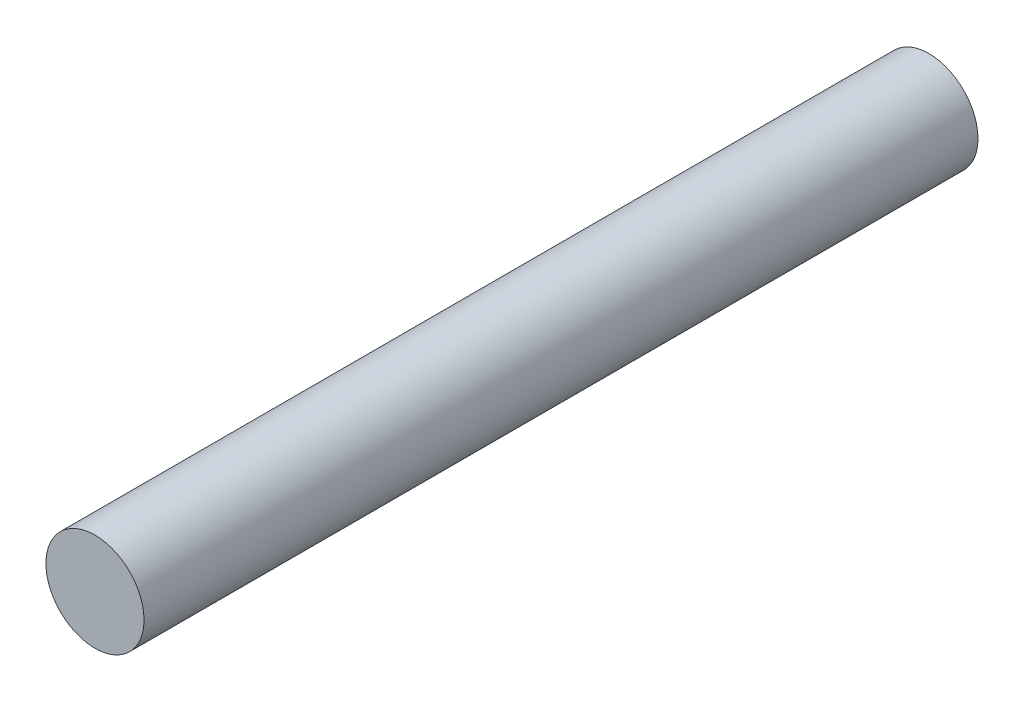
ISO-10303-21;
HEADER;
FILE_DESCRIPTION(('STEP AP214'),'2;1');
FILE_NAME('part.step','',(''),(''),'','','');
FILE_SCHEMA(('AUTOMOTIVE_DESIGN { 1 0 10303 214 1 1 1 1 }'));
ENDSEC;
DATA;
#1=APPLICATION_CONTEXT('core data for automotive mechanical design processes');
#2=APPLICATION_PROTOCOL_DEFINITION('international standard','automotive_design',2000,#1);
#3=PRODUCT_CONTEXT('',#1,'mechanical');
#4=PRODUCT('Part','Part','',(#3));
#5=PRODUCT_RELATED_PRODUCT_CATEGORY('part','',(#4));
#6=PRODUCT_DEFINITION_FORMATION('','',#4);
#7=PRODUCT_DEFINITION_CONTEXT('part definition',#1,'design');
#8=PRODUCT_DEFINITION('design','',#6,#7);
#9=PRODUCT_DEFINITION_SHAPE('','',#8);
#10=(LENGTH_UNIT() NAMED_UNIT(*) SI_UNIT(.MILLI.,.METRE.));
#11=(NAMED_UNIT(*) PLANE_ANGLE_UNIT() SI_UNIT($,.RADIAN.));
#12=(NAMED_UNIT(*) SI_UNIT($,.STERADIAN.) SOLID_ANGLE_UNIT());
#13=UNCERTAINTY_MEASURE_WITH_UNIT(LENGTH_MEASURE(1.E-05),#10,'distance_accuracy_value','');
#14=(GEOMETRIC_REPRESENTATION_CONTEXT(3) GLOBAL_UNCERTAINTY_ASSIGNED_CONTEXT((#13)) GLOBAL_UNIT_ASSIGNED_CONTEXT((#10,
#11,#12)) REPRESENTATION_CONTEXT('',''));
#15=CARTESIAN_POINT('',(0.,0.,0.));
#16=DIRECTION('',(0.,0.,1.));
#17=DIRECTION('',(1.,0.,0.));
#18=AXIS2_PLACEMENT_3D('',#15,#16,#17);
#19=CARTESIAN_POINT('',(0.,0.,34.));
#20=DIRECTION('',(0.,0.,-1.));
#21=DIRECTION('',(-1.,0.,0.));
#22=AXIS2_PLACEMENT_3D('',#19,#20,#21);
#23=CYLINDRICAL_SURFACE('',#22,4.);
#24=CARTESIAN_POINT('',(0.,0.,34.));
#25=DIRECTION('',(0.,0.,1.));
#26=DIRECTION('',(1.,0.,0.));
#27=AXIS2_PLACEMENT_3D('',#24,#25,#26);
#28=CIRCLE('',#27,4.);
#29=CARTESIAN_POINT('',(4.,0.,34.));
#30=VERTEX_POINT('',#29);
#31=EDGE_CURVE('E10',#30,#30,#28,.T.);
#32=ORIENTED_EDGE('',*,*,#31,.F.);
#33=EDGE_LOOP('',(#32));
#34=FACE_BOUND('',#33,.T.);
#35=CARTESIAN_POINT('',(0.,0.,-34.));
#36=DIRECTION('',(0.,0.,1.));
#37=DIRECTION('',(1.,0.,0.));
#38=AXIS2_PLACEMENT_3D('',#35,#36,#37);
#39=CIRCLE('',#38,4.);
#40=CARTESIAN_POINT('',(4.,0.,-34.));
#41=VERTEX_POINT('',#40);
#42=EDGE_CURVE('E46',#41,#41,#39,.T.);
#43=ORIENTED_EDGE('',*,*,#42,.T.);
#44=EDGE_LOOP('',(#43));
#45=FACE_BOUND('',#44,.T.);
#46=ADVANCED_FACE('F43',(#34,#45),#23,.T.);
#47=CARTESIAN_POINT('',(0.,0.,34.));
#48=DIRECTION('',(0.,0.,1.));
#49=DIRECTION('',(1.,0.,0.));
#50=AXIS2_PLACEMENT_3D('',#47,#48,#49);
#51=PLANE('',#50);
#52=ORIENTED_EDGE('',*,*,#31,.T.);
#53=EDGE_LOOP('',(#52));
#54=FACE_BOUND('',#53,.T.);
#55=ADVANCED_FACE('F60',(#54),#51,.T.);
#56=CARTESIAN_POINT('',(0.,0.,-34.));
#57=DIRECTION('',(0.,0.,1.));
#58=DIRECTION('',(1.,0.,0.));
#59=AXIS2_PLACEMENT_3D('',#56,#57,#58);
#60=PLANE('',#59);
#61=ORIENTED_EDGE('',*,*,#42,.F.);
#62=EDGE_LOOP('',(#61));
#63=FACE_BOUND('',#62,.T.);
#64=ADVANCED_FACE('F58',(#63),#60,.F.);
#65=CLOSED_SHELL('',(#46,#55,#64));
#66=MANIFOLD_SOLID_BREP('B2',#65);
#67=ADVANCED_BREP_SHAPE_REPRESENTATION('',(#18,#66),#14);
#68=SHAPE_DEFINITION_REPRESENTATION(#9,#67);
ENDSEC;
END-ISO-10303-21;
